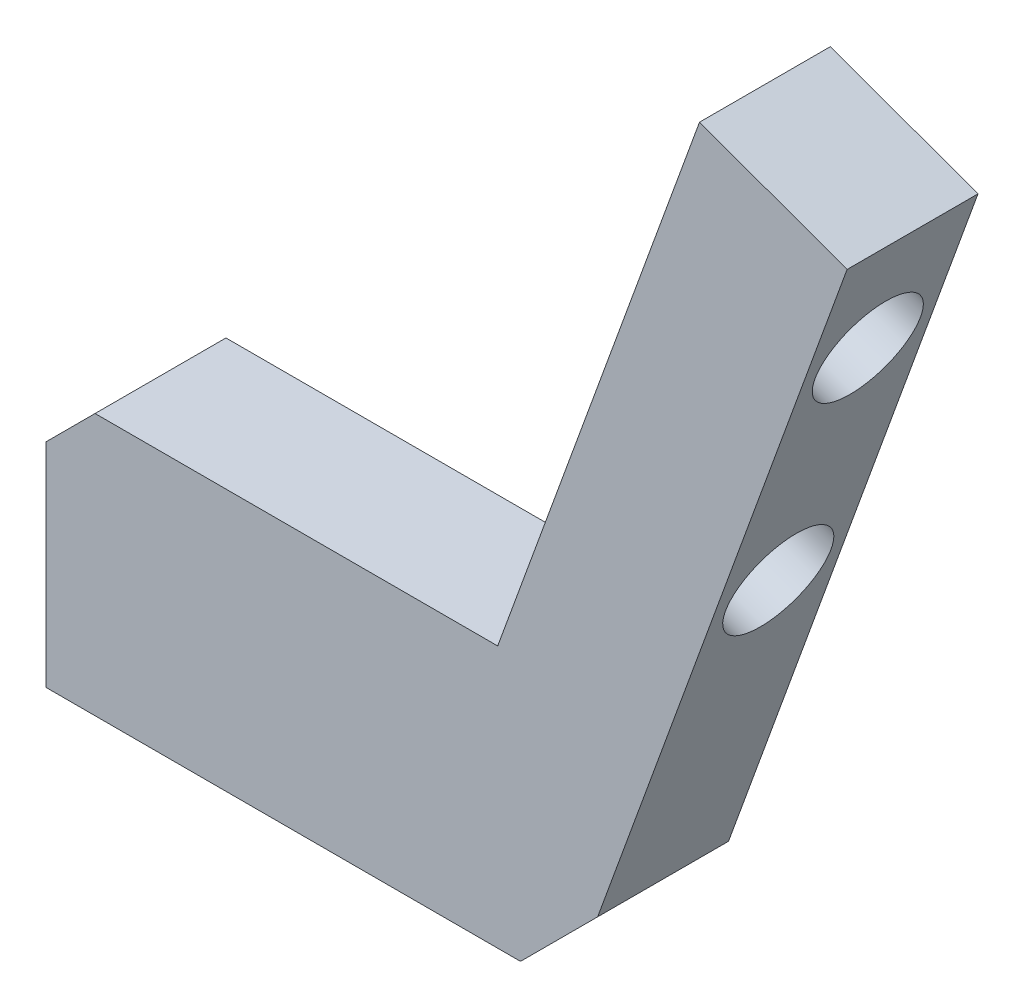
ISO-10303-21;
HEADER;
FILE_DESCRIPTION(('STEP AP214'),'2;1');
FILE_NAME('part.step','',(''),(''),'','','');
FILE_SCHEMA(('AUTOMOTIVE_DESIGN { 1 0 10303 214 1 1 1 1 }'));
ENDSEC;
DATA;
#1=APPLICATION_CONTEXT('core data for automotive mechanical design processes');
#2=APPLICATION_PROTOCOL_DEFINITION('international standard','automotive_design',2000,#1);
#3=PRODUCT_CONTEXT('',#1,'mechanical');
#4=PRODUCT('Part','Part','',(#3));
#5=PRODUCT_RELATED_PRODUCT_CATEGORY('part','',(#4));
#6=PRODUCT_DEFINITION_FORMATION('','',#4);
#7=PRODUCT_DEFINITION_CONTEXT('part definition',#1,'design');
#8=PRODUCT_DEFINITION('design','',#6,#7);
#9=PRODUCT_DEFINITION_SHAPE('','',#8);
#10=(LENGTH_UNIT() NAMED_UNIT(*) SI_UNIT(.MILLI.,.METRE.));
#11=(NAMED_UNIT(*) PLANE_ANGLE_UNIT() SI_UNIT($,.RADIAN.));
#12=(NAMED_UNIT(*) SI_UNIT($,.STERADIAN.) SOLID_ANGLE_UNIT());
#13=UNCERTAINTY_MEASURE_WITH_UNIT(LENGTH_MEASURE(1.E-05),#10,'distance_accuracy_value','');
#14=(GEOMETRIC_REPRESENTATION_CONTEXT(3) GLOBAL_UNCERTAINTY_ASSIGNED_CONTEXT((#13)) GLOBAL_UNIT_ASSIGNED_CONTEXT((#10,
#11,#12)) REPRESENTATION_CONTEXT('',''));
#15=CARTESIAN_POINT('',(0.,0.,0.));
#16=DIRECTION('',(0.,0.,1.));
#17=DIRECTION('',(1.,0.,0.));
#18=AXIS2_PLACEMENT_3D('',#15,#16,#17);
#19=CARTESIAN_POINT('',(-25.4,12.7,3.175));
#20=DIRECTION('',(1.,0.,0.));
#21=DIRECTION('',(0.,0.,-1.));
#22=AXIS2_PLACEMENT_3D('',#19,#20,#21);
#23=PLANE('',#22);
#24=DIRECTION('',(0.,-1.,0.));
#25=VECTOR('',#24,1.);
#26=CARTESIAN_POINT('',(-25.4,12.7,3.175));
#27=LINE('',#26,#25);
#28=CARTESIAN_POINT('',(-25.4,10.32,3.175));
#29=VERTEX_POINT('',#28);
#30=CARTESIAN_POINT('',(-25.4,0.,3.175));
#31=VERTEX_POINT('',#30);
#32=EDGE_CURVE('E130',#29,#31,#27,.T.);
#33=ORIENTED_EDGE('',*,*,#32,.F.);
#34=DIRECTION('',(0.,0.,-1.));
#35=VECTOR('',#34,1.);
#36=CARTESIAN_POINT('',(-25.4,10.32,3.175));
#37=LINE('',#36,#35);
#38=CARTESIAN_POINT('',(-25.4,10.32,-3.175));
#39=VERTEX_POINT('',#38);
#40=EDGE_CURVE('E167',#29,#39,#37,.T.);
#41=ORIENTED_EDGE('',*,*,#40,.T.);
#42=DIRECTION('',(0.,-1.,0.));
#43=VECTOR('',#42,1.);
#44=CARTESIAN_POINT('',(-25.4,12.7,-3.175));
#45=LINE('',#44,#43);
#46=CARTESIAN_POINT('',(-25.4,0.,-3.175));
#47=VERTEX_POINT('',#46);
#48=EDGE_CURVE('E129',#39,#47,#45,.T.);
#49=ORIENTED_EDGE('',*,*,#48,.T.);
#50=DIRECTION('',(0.,0.,-1.));
#51=VECTOR('',#50,1.);
#52=CARTESIAN_POINT('',(-25.4,0.,3.175));
#53=LINE('',#52,#51);
#54=EDGE_CURVE('E164',#31,#47,#53,.T.);
#55=ORIENTED_EDGE('',*,*,#54,.F.);
#56=EDGE_LOOP('',(#33,#41,#49,#55));
#57=FACE_BOUND('',#56,.T.);
#58=ADVANCED_FACE('F35',(#57),#23,.F.);
#59=CARTESIAN_POINT('',(-25.4,0.,3.175));
#60=DIRECTION('',(0.,1.,0.));
#61=DIRECTION('',(0.,0.,1.));
#62=AXIS2_PLACEMENT_3D('',#59,#60,#61);
#63=PLANE('',#62);
#64=CARTESIAN_POINT('',(-22.225,0.,0.));
#65=DIRECTION('',(0.,-1.,0.));
#66=DIRECTION('',(0.,0.,-1.));
#67=AXIS2_PLACEMENT_3D('',#64,#65,#66);
#68=CIRCLE('',#67,1.89865);
#69=CARTESIAN_POINT('',(-22.225,0.,-1.89865));
#70=VERTEX_POINT('',#69);
#71=EDGE_CURVE('E117',#70,#70,#68,.T.);
#72=ORIENTED_EDGE('',*,*,#71,.F.);
#73=EDGE_LOOP('',(#72));
#74=FACE_BOUND('',#73,.T.);
#75=CARTESIAN_POINT('',(-9.525,0.,0.));
#76=DIRECTION('',(0.,-1.,0.));
#77=DIRECTION('',(0.,0.,-1.));
#78=AXIS2_PLACEMENT_3D('',#75,#76,#77);
#79=CIRCLE('',#78,1.89865);
#80=CARTESIAN_POINT('',(-9.525,0.,-1.89865));
#81=VERTEX_POINT('',#80);
#82=EDGE_CURVE('E116',#81,#81,#79,.T.);
#83=ORIENTED_EDGE('',*,*,#82,.F.);
#84=EDGE_LOOP('',(#83));
#85=FACE_BOUND('',#84,.T.);
#86=DIRECTION('',(1.,0.,0.));
#87=VECTOR('',#86,1.);
#88=CARTESIAN_POINT('',(-25.4,0.,-3.175));
#89=LINE('',#88,#87);
#90=CARTESIAN_POINT('',(-2.38000000000002,0.,-3.175));
#91=VERTEX_POINT('',#90);
#92=EDGE_CURVE('E146',#47,#91,#89,.T.);
#93=ORIENTED_EDGE('',*,*,#92,.T.);
#94=DIRECTION('',(0.,0.,1.));
#95=VECTOR('',#94,1.);
#96=CARTESIAN_POINT('',(-2.38000000000002,0.,3.175));
#97=LINE('',#96,#95);
#98=CARTESIAN_POINT('',(-2.38000000000002,0.,3.175));
#99=VERTEX_POINT('',#98);
#100=EDGE_CURVE('E11',#91,#99,#97,.T.);
#101=ORIENTED_EDGE('',*,*,#100,.T.);
#102=DIRECTION('',(1.,0.,0.));
#103=VECTOR('',#102,1.);
#104=CARTESIAN_POINT('',(-25.4,0.,3.175));
#105=LINE('',#104,#103);
#106=EDGE_CURVE('E132',#31,#99,#105,.T.);
#107=ORIENTED_EDGE('',*,*,#106,.F.);
#108=ORIENTED_EDGE('',*,*,#54,.T.);
#109=EDGE_LOOP('',(#93,#101,#107,#108));
#110=FACE_BOUND('',#109,.T.);
#111=ADVANCED_FACE('F212',(#74,#85,#110),#63,.F.);
#112=CARTESIAN_POINT('',(0.,0.,3.175));
#113=DIRECTION('',(-0.93969262078591,0.342020143325666,0.));
#114=DIRECTION('',(-0.342020143325666,-0.93969262078591,0.));
#115=AXIS2_PLACEMENT_3D('',#112,#113,#114);
#116=PLANE('',#115);
#117=CARTESIAN_POINT('',(11.2935051326135,31.0286503383508,0.));
#118=DIRECTION('',(0.93969262078591,-0.342020143325666,0.));
#119=DIRECTION('',(0.342020143325666,0.93969262078591,0.));
#120=AXIS2_PLACEMENT_3D('',#117,#118,#119);
#121=CIRCLE('',#120,2.5527);
#122=CARTESIAN_POINT('',(12.1665799524809,33.4274036914309,0.));
#123=VERTEX_POINT('',#122);
#124=EDGE_CURVE('E266',#123,#123,#121,.T.);
#125=ORIENTED_EDGE('',*,*,#124,.F.);
#126=EDGE_LOOP('',(#125));
#127=FACE_BOUND('',#126,.T.);
#128=CARTESIAN_POINT('',(6.94984931237753,19.0945540543697,0.));
#129=DIRECTION('',(0.93969262078591,-0.342020143325666,0.));
#130=DIRECTION('',(0.342020143325666,0.93969262078591,0.));
#131=AXIS2_PLACEMENT_3D('',#128,#129,#130);
#132=CIRCLE('',#131,2.5527);
#133=CARTESIAN_POINT('',(7.82292413224496,21.4933074074499,0.));
#134=VERTEX_POINT('',#133);
#135=EDGE_CURVE('E269',#134,#134,#132,.T.);
#136=ORIENTED_EDGE('',*,*,#135,.F.);
#137=EDGE_LOOP('',(#136));
#138=FACE_BOUND('',#137,.T.);
#139=DIRECTION('',(0.342020143325666,0.93969262078591,0.));
#140=VECTOR('',#139,1.);
#141=CARTESIAN_POINT('',(0.,0.,3.175));
#142=LINE('',#141,#140);
#143=CARTESIAN_POINT('',(1.36196323540636,3.74196323540636,3.175));
#144=VERTEX_POINT('',#143);
#145=CARTESIAN_POINT('',(13.4653330427315,36.9956984803413,3.175));
#146=VERTEX_POINT('',#145);
#147=EDGE_CURVE('E135',#144,#146,#142,.T.);
#148=ORIENTED_EDGE('',*,*,#147,.F.);
#149=DIRECTION('',(0.,0.,-1.));
#150=VECTOR('',#149,1.);
#151=CARTESIAN_POINT('',(1.36196323540636,3.74196323540636,3.175));
#152=LINE('',#151,#150);
#153=CARTESIAN_POINT('',(1.36196323540636,3.74196323540636,-3.175));
#154=VERTEX_POINT('',#153);
#155=EDGE_CURVE('E45',#144,#154,#152,.T.);
#156=ORIENTED_EDGE('',*,*,#155,.T.);
#157=DIRECTION('',(0.342020143325666,0.93969262078591,0.));
#158=VECTOR('',#157,1.);
#159=CARTESIAN_POINT('',(0.,0.,-3.175));
#160=LINE('',#159,#158);
#161=CARTESIAN_POINT('',(13.4653330427315,36.9956984803413,-3.175));
#162=VERTEX_POINT('',#161);
#163=EDGE_CURVE('E148',#154,#162,#160,.T.);
#164=ORIENTED_EDGE('',*,*,#163,.T.);
#165=DIRECTION('',(0.,0.,-1.));
#166=VECTOR('',#165,1.);
#167=CARTESIAN_POINT('',(13.4653330427315,36.9956984803413,3.175));
#168=LINE('',#167,#166);
#169=EDGE_CURVE('E161',#146,#162,#168,.T.);
#170=ORIENTED_EDGE('',*,*,#169,.F.);
#171=EDGE_LOOP('',(#148,#156,#164,#170));
#172=FACE_BOUND('',#171,.T.);
#173=ADVANCED_FACE('F183',(#127,#138,#172),#116,.F.);
#174=CARTESIAN_POINT('',(13.4653330427315,36.9956984803413,3.175));
#175=DIRECTION('',(-0.342020143325664,-0.93969262078591,0.));
#176=DIRECTION('',(0.93969262078591,-0.342020143325665,0.));
#177=AXIS2_PLACEMENT_3D('',#174,#175,#176);
#178=PLANE('',#177);
#179=DIRECTION('',(-0.93969262078591,0.342020143325664,0.));
#180=VECTOR('',#179,1.);
#181=CARTESIAN_POINT('',(13.4653330427315,36.9956984803413,-3.175));
#182=LINE('',#181,#180);
#183=CARTESIAN_POINT('',(6.30487527234282,39.6018919724828,-3.175));
#184=VERTEX_POINT('',#183);
#185=EDGE_CURVE('E150',#162,#184,#182,.T.);
#186=ORIENTED_EDGE('',*,*,#185,.T.);
#187=DIRECTION('',(0.,0.,-1.));
#188=VECTOR('',#187,1.);
#189=CARTESIAN_POINT('',(6.30487527234282,39.6018919724828,3.175));
#190=LINE('',#189,#188);
#191=CARTESIAN_POINT('',(6.30487527234282,39.6018919724828,3.175));
#192=VERTEX_POINT('',#191);
#193=EDGE_CURVE('E158',#192,#184,#190,.T.);
#194=ORIENTED_EDGE('',*,*,#193,.F.);
#195=DIRECTION('',(-0.93969262078591,0.342020143325664,0.));
#196=VECTOR('',#195,1.);
#197=CARTESIAN_POINT('',(13.4653330427315,36.9956984803413,3.175));
#198=LINE('',#197,#196);
#199=EDGE_CURVE('E137',#146,#192,#198,.T.);
#200=ORIENTED_EDGE('',*,*,#199,.F.);
#201=ORIENTED_EDGE('',*,*,#169,.T.);
#202=EDGE_LOOP('',(#186,#194,#200,#201));
#203=FACE_BOUND('',#202,.T.);
#204=ADVANCED_FACE('F195',(#203),#178,.F.);
#205=CARTESIAN_POINT('',(6.30487527234282,39.6018919724828,3.175));
#206=DIRECTION('',(0.93969262078591,-0.342020143325665,0.));
#207=DIRECTION('',(0.342020143325665,0.93969262078591,0.));
#208=AXIS2_PLACEMENT_3D('',#205,#206,#207);
#209=PLANE('',#208);
#210=CARTESIAN_POINT('',(4.13304736222486,33.6348438304923,0.));
#211=DIRECTION('',(0.93969262078591,-0.342020143325665,0.));
#212=DIRECTION('',(0.342020143325665,0.93969262078591,0.));
#213=AXIS2_PLACEMENT_3D('',#210,#211,#212);
#214=CIRCLE('',#213,2.5527);
#215=CARTESIAN_POINT('',(5.00612218209229,36.0335971835725,0.));
#216=VERTEX_POINT('',#215);
#217=EDGE_CURVE('E40',#216,#216,#214,.T.);
#218=ORIENTED_EDGE('',*,*,#217,.T.);
#219=EDGE_LOOP('',(#218));
#220=FACE_BOUND('',#219,.T.);
#221=CARTESIAN_POINT('',(-0.210608458011091,21.7007475465113,0.));
#222=DIRECTION('',(0.93969262078591,-0.342020143325665,0.));
#223=DIRECTION('',(0.342020143325665,0.93969262078591,0.));
#224=AXIS2_PLACEMENT_3D('',#221,#222,#223);
#225=CIRCLE('',#224,2.5527);
#226=CARTESIAN_POINT('',(0.662466361856334,24.0995008995915,0.));
#227=VERTEX_POINT('',#226);
#228=EDGE_CURVE('E123',#227,#227,#225,.T.);
#229=ORIENTED_EDGE('',*,*,#228,.T.);
#230=EDGE_LOOP('',(#229));
#231=FACE_BOUND('',#230,.T.);
#232=DIRECTION('',(-0.342020143325665,-0.93969262078591,0.));
#233=VECTOR('',#232,1.);
#234=CARTESIAN_POINT('',(6.30487527234282,39.6018919724828,-3.175));
#235=LINE('',#234,#233);
#236=CARTESIAN_POINT('',(-3.48661265108571,12.7,-3.175));
#237=VERTEX_POINT('',#236);
#238=EDGE_CURVE('E152',#184,#237,#235,.T.);
#239=ORIENTED_EDGE('',*,*,#238,.T.);
#240=DIRECTION('',(0.,0.,-1.));
#241=VECTOR('',#240,1.);
#242=CARTESIAN_POINT('',(-3.48661265108571,12.7,3.175));
#243=LINE('',#242,#241);
#244=CARTESIAN_POINT('',(-3.48661265108571,12.7,3.175));
#245=VERTEX_POINT('',#244);
#246=EDGE_CURVE('E144',#245,#237,#243,.T.);
#247=ORIENTED_EDGE('',*,*,#246,.F.);
#248=DIRECTION('',(-0.342020143325665,-0.93969262078591,0.));
#249=VECTOR('',#248,1.);
#250=CARTESIAN_POINT('',(6.30487527234282,39.6018919724828,3.175));
#251=LINE('',#250,#249);
#252=EDGE_CURVE('E139',#192,#245,#251,.T.);
#253=ORIENTED_EDGE('',*,*,#252,.F.);
#254=ORIENTED_EDGE('',*,*,#193,.T.);
#255=EDGE_LOOP('',(#239,#247,#253,#254));
#256=FACE_BOUND('',#255,.T.);
#257=ADVANCED_FACE('F199',(#220,#231,#256),#209,.F.);
#258=CARTESIAN_POINT('',(-25.4,12.7,3.175));
#259=DIRECTION('',(0.,-1.,0.));
#260=DIRECTION('',(0.,0.,-1.));
#261=AXIS2_PLACEMENT_3D('',#258,#259,#260);
#262=PLANE('',#261);
#263=DIRECTION('',(-1.,0.,0.));
#264=VECTOR('',#263,1.);
#265=CARTESIAN_POINT('',(-25.4,12.7,-3.175));
#266=LINE('',#265,#264);
#267=CARTESIAN_POINT('',(-23.02,12.7,-3.175));
#268=VERTEX_POINT('',#267);
#269=EDGE_CURVE('E133',#237,#268,#266,.T.);
#270=ORIENTED_EDGE('',*,*,#269,.T.);
#271=DIRECTION('',(0.,0.,1.));
#272=VECTOR('',#271,1.);
#273=CARTESIAN_POINT('',(-23.02,12.7,3.175));
#274=LINE('',#273,#272);
#275=CARTESIAN_POINT('',(-23.02,12.7,3.175));
#276=VERTEX_POINT('',#275);
#277=EDGE_CURVE('E174',#268,#276,#274,.T.);
#278=ORIENTED_EDGE('',*,*,#277,.T.);
#279=DIRECTION('',(-1.,0.,0.));
#280=VECTOR('',#279,1.);
#281=CARTESIAN_POINT('',(-25.4,12.7,3.175));
#282=LINE('',#281,#280);
#283=EDGE_CURVE('E141',#245,#276,#282,.T.);
#284=ORIENTED_EDGE('',*,*,#283,.F.);
#285=ORIENTED_EDGE('',*,*,#246,.T.);
#286=EDGE_LOOP('',(#270,#278,#284,#285));
#287=FACE_BOUND('',#286,.T.);
#288=ADVANCED_FACE('F242',(#287),#262,.F.);
#289=CARTESIAN_POINT('',(0.,0.,3.175));
#290=DIRECTION('',(0.,0.,1.));
#291=DIRECTION('',(1.,0.,0.));
#292=AXIS2_PLACEMENT_3D('',#289,#290,#291);
#293=PLANE('',#292);
#294=ORIENTED_EDGE('',*,*,#283,.T.);
#295=DIRECTION('',(0.707106781186549,0.707106781186546,0.));
#296=VECTOR('',#295,1.);
#297=CARTESIAN_POINT('',(-17.86,17.86,3.175));
#298=LINE('',#297,#296);
#299=EDGE_CURVE('E177',#276,#29,#298,.F.);
#300=ORIENTED_EDGE('',*,*,#299,.T.);
#301=ORIENTED_EDGE('',*,*,#32,.T.);
#302=ORIENTED_EDGE('',*,*,#106,.T.);
#303=DIRECTION('',(-0.707106781186549,-0.707106781186546,0.));
#304=VECTOR('',#303,1.);
#305=CARTESIAN_POINT('',(-1.19,1.19000000000001,3.175));
#306=LINE('',#305,#304);
#307=EDGE_CURVE('E52',#99,#144,#306,.F.);
#308=ORIENTED_EDGE('',*,*,#307,.T.);
#309=ORIENTED_EDGE('',*,*,#147,.T.);
#310=ORIENTED_EDGE('',*,*,#199,.T.);
#311=ORIENTED_EDGE('',*,*,#252,.T.);
#312=EDGE_LOOP('',(#294,#300,#301,#302,#308,#309,#310,#311));
#313=FACE_BOUND('',#312,.T.);
#314=ADVANCED_FACE('F202',(#313),#293,.T.);
#315=CARTESIAN_POINT('',(0.,0.,-3.175));
#316=DIRECTION('',(0.,0.,1.));
#317=DIRECTION('',(1.,0.,0.));
#318=AXIS2_PLACEMENT_3D('',#315,#316,#317);
#319=PLANE('',#318);
#320=ORIENTED_EDGE('',*,*,#48,.F.);
#321=DIRECTION('',(-0.707106781186549,-0.707106781186546,0.));
#322=VECTOR('',#321,1.);
#323=CARTESIAN_POINT('',(-25.4,10.32,-3.175));
#324=LINE('',#323,#322);
#325=EDGE_CURVE('E172',#39,#268,#324,.F.);
#326=ORIENTED_EDGE('',*,*,#325,.T.);
#327=ORIENTED_EDGE('',*,*,#269,.F.);
#328=ORIENTED_EDGE('',*,*,#238,.F.);
#329=ORIENTED_EDGE('',*,*,#185,.F.);
#330=ORIENTED_EDGE('',*,*,#163,.F.);
#331=DIRECTION('',(0.707106781186549,0.707106781186546,0.));
#332=VECTOR('',#331,1.);
#333=CARTESIAN_POINT('',(1.36196323540636,3.74196323540636,-3.175));
#334=LINE('',#333,#332);
#335=EDGE_CURVE('E170',#154,#91,#334,.F.);
#336=ORIENTED_EDGE('',*,*,#335,.T.);
#337=ORIENTED_EDGE('',*,*,#92,.F.);
#338=EDGE_LOOP('',(#320,#326,#327,#328,#329,#330,#336,#337));
#339=FACE_BOUND('',#338,.T.);
#340=ADVANCED_FACE('F189',(#339),#319,.F.);
#341=CARTESIAN_POINT('',(-9.525,10.16,0.));
#342=DIRECTION('',(0.,-1.,0.));
#343=DIRECTION('',(0.,0.,-1.));
#344=AXIS2_PLACEMENT_3D('',#341,#342,#343);
#345=CONICAL_SURFACE('',#344,1.89865,1.02974425867665);
#346=CARTESIAN_POINT('',(-9.525,11.3008240143167,0.));
#347=VERTEX_POINT('',#346);
#348=VERTEX_LOOP('',#347);
#349=FACE_BOUND('',#348,.T.);
#350=CARTESIAN_POINT('',(-9.525,10.16,0.));
#351=DIRECTION('',(0.,-1.,0.));
#352=DIRECTION('',(0.,0.,-1.));
#353=AXIS2_PLACEMENT_3D('',#350,#351,#352);
#354=CIRCLE('',#353,1.89865);
#355=CARTESIAN_POINT('',(-9.525,10.16,-1.89865));
#356=VERTEX_POINT('',#355);
#357=EDGE_CURVE('E120',#356,#356,#354,.T.);
#358=ORIENTED_EDGE('',*,*,#357,.T.);
#359=EDGE_LOOP('',(#358));
#360=FACE_BOUND('',#359,.T.);
#361=ADVANCED_FACE('F248',(#349,#360),#345,.F.);
#362=CARTESIAN_POINT('',(-9.525,0.,0.));
#363=DIRECTION('',(0.,-1.,0.));
#364=DIRECTION('',(0.,0.,-1.));
#365=AXIS2_PLACEMENT_3D('',#362,#363,#364);
#366=CYLINDRICAL_SURFACE('',#365,1.89865);
#367=ORIENTED_EDGE('',*,*,#357,.F.);
#368=EDGE_LOOP('',(#367));
#369=FACE_BOUND('',#368,.T.);
#370=ORIENTED_EDGE('',*,*,#82,.T.);
#371=EDGE_LOOP('',(#370));
#372=FACE_BOUND('',#371,.T.);
#373=ADVANCED_FACE('F110',(#369,#372),#366,.F.);
#374=CARTESIAN_POINT('',(-22.225,10.16,0.));
#375=DIRECTION('',(0.,-1.,0.));
#376=DIRECTION('',(0.,0.,-1.));
#377=AXIS2_PLACEMENT_3D('',#374,#375,#376);
#378=CONICAL_SURFACE('',#377,1.89865,1.02974425867665);
#379=CARTESIAN_POINT('',(-22.225,11.3008240143167,0.));
#380=VERTEX_POINT('',#379);
#381=VERTEX_LOOP('',#380);
#382=FACE_BOUND('',#381,.T.);
#383=CARTESIAN_POINT('',(-22.225,10.16,0.));
#384=DIRECTION('',(0.,-1.,0.));
#385=DIRECTION('',(0.,0.,-1.));
#386=AXIS2_PLACEMENT_3D('',#383,#384,#385);
#387=CIRCLE('',#386,1.89865);
#388=CARTESIAN_POINT('',(-22.225,10.16,-1.89865));
#389=VERTEX_POINT('',#388);
#390=EDGE_CURVE('E114',#389,#389,#387,.T.);
#391=ORIENTED_EDGE('',*,*,#390,.T.);
#392=EDGE_LOOP('',(#391));
#393=FACE_BOUND('',#392,.T.);
#394=ADVANCED_FACE('F106',(#382,#393),#378,.F.);
#395=CARTESIAN_POINT('',(-22.225,0.,0.));
#396=DIRECTION('',(0.,-1.,0.));
#397=DIRECTION('',(0.,0.,-1.));
#398=AXIS2_PLACEMENT_3D('',#395,#396,#397);
#399=CYLINDRICAL_SURFACE('',#398,1.89865);
#400=ORIENTED_EDGE('',*,*,#390,.F.);
#401=EDGE_LOOP('',(#400));
#402=FACE_BOUND('',#401,.T.);
#403=ORIENTED_EDGE('',*,*,#71,.T.);
#404=EDGE_LOOP('',(#403));
#405=FACE_BOUND('',#404,.T.);
#406=ADVANCED_FACE('F109',(#402,#405),#399,.F.);
#407=CARTESIAN_POINT('',(-25.4,10.32,3.175));
#408=DIRECTION('',(0.707106781186546,-0.707106781186549,0.));
#409=DIRECTION('',(0.,0.,-1.));
#410=AXIS2_PLACEMENT_3D('',#407,#408,#409);
#411=PLANE('',#410);
#412=ORIENTED_EDGE('',*,*,#299,.F.);
#413=ORIENTED_EDGE('',*,*,#277,.F.);
#414=ORIENTED_EDGE('',*,*,#325,.F.);
#415=ORIENTED_EDGE('',*,*,#40,.F.);
#416=EDGE_LOOP('',(#412,#413,#414,#415));
#417=FACE_BOUND('',#416,.T.);
#418=ADVANCED_FACE('F209',(#417),#411,.F.);
#419=CARTESIAN_POINT('',(1.36196323540636,3.74196323540636,3.175));
#420=DIRECTION('',(-0.707106781186546,0.707106781186549,0.));
#421=DIRECTION('',(0.,0.,-1.));
#422=AXIS2_PLACEMENT_3D('',#419,#420,#421);
#423=PLANE('',#422);
#424=ORIENTED_EDGE('',*,*,#307,.F.);
#425=ORIENTED_EDGE('',*,*,#100,.F.);
#426=ORIENTED_EDGE('',*,*,#335,.F.);
#427=ORIENTED_EDGE('',*,*,#155,.F.);
#428=EDGE_LOOP('',(#424,#425,#426,#427));
#429=FACE_BOUND('',#428,.T.);
#430=ADVANCED_FACE('F38',(#429),#423,.F.);
#431=CARTESIAN_POINT('',(6.94984931237753,19.0945540543697,0.));
#432=DIRECTION('',(0.93969262078591,-0.342020143325666,0.));
#433=DIRECTION('',(0.342020143325666,0.93969262078591,0.));
#434=AXIS2_PLACEMENT_3D('',#431,#432,#433);
#435=CYLINDRICAL_SURFACE('',#434,2.5527);
#436=ORIENTED_EDGE('',*,*,#135,.T.);
#437=EDGE_LOOP('',(#436));
#438=FACE_BOUND('',#437,.T.);
#439=ORIENTED_EDGE('',*,*,#228,.F.);
#440=EDGE_LOOP('',(#439));
#441=FACE_BOUND('',#440,.T.);
#442=ADVANCED_FACE('F214',(#438,#441),#435,.F.);
#443=CARTESIAN_POINT('',(11.2935051326135,31.0286503383508,0.));
#444=DIRECTION('',(0.93969262078591,-0.342020143325666,0.));
#445=DIRECTION('',(0.342020143325666,0.93969262078591,0.));
#446=AXIS2_PLACEMENT_3D('',#443,#444,#445);
#447=CYLINDRICAL_SURFACE('',#446,2.5527);
#448=ORIENTED_EDGE('',*,*,#124,.T.);
#449=EDGE_LOOP('',(#448));
#450=FACE_BOUND('',#449,.T.);
#451=ORIENTED_EDGE('',*,*,#217,.F.);
#452=EDGE_LOOP('',(#451));
#453=FACE_BOUND('',#452,.T.);
#454=ADVANCED_FACE('F219',(#450,#453),#447,.F.);
#455=CLOSED_SHELL('',(#58,#111,#173,#204,#257,#288,#314,#340,#361,#373,#394,#406,#418,#430,#442,#454));
#456=MANIFOLD_SOLID_BREP('B2',#455);
#457=ADVANCED_BREP_SHAPE_REPRESENTATION('',(#18,#456),#14);
#458=SHAPE_DEFINITION_REPRESENTATION(#9,#457);
ENDSEC;
END-ISO-10303-21;
